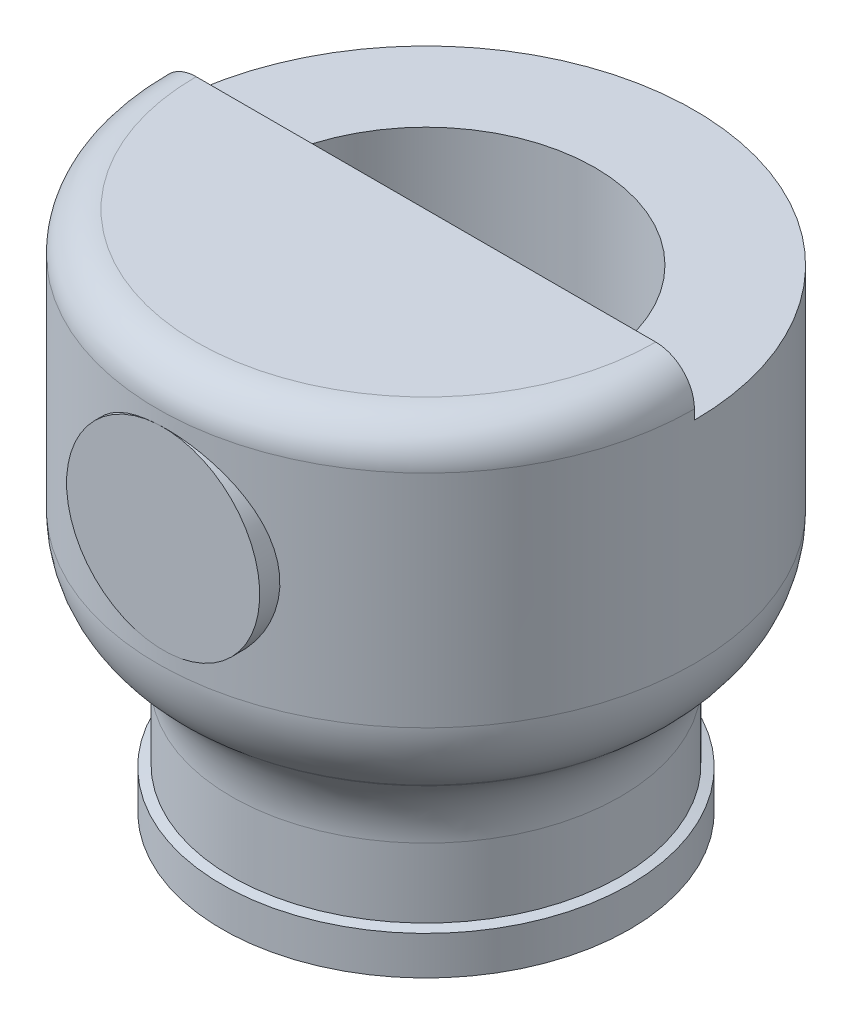
ISO-10303-21;
HEADER;
FILE_DESCRIPTION(('STEP AP214'),'2;1');
FILE_NAME('part.step','',(''),(''),'','','');
FILE_SCHEMA(('AUTOMOTIVE_DESIGN { 1 0 10303 214 1 1 1 1 }'));
ENDSEC;
DATA;
#1=APPLICATION_CONTEXT('core data for automotive mechanical design processes');
#2=APPLICATION_PROTOCOL_DEFINITION('international standard','automotive_design',2000,#1);
#3=PRODUCT_CONTEXT('',#1,'mechanical');
#4=PRODUCT('Part','Part','',(#3));
#5=PRODUCT_RELATED_PRODUCT_CATEGORY('part','',(#4));
#6=PRODUCT_DEFINITION_FORMATION('','',#4);
#7=PRODUCT_DEFINITION_CONTEXT('part definition',#1,'design');
#8=PRODUCT_DEFINITION('design','',#6,#7);
#9=PRODUCT_DEFINITION_SHAPE('','',#8);
#10=(LENGTH_UNIT() NAMED_UNIT(*) SI_UNIT(.MILLI.,.METRE.));
#11=(NAMED_UNIT(*) PLANE_ANGLE_UNIT() SI_UNIT($,.RADIAN.));
#12=(NAMED_UNIT(*) SI_UNIT($,.STERADIAN.) SOLID_ANGLE_UNIT());
#13=UNCERTAINTY_MEASURE_WITH_UNIT(LENGTH_MEASURE(1.E-05),#10,'distance_accuracy_value','');
#14=(GEOMETRIC_REPRESENTATION_CONTEXT(3) GLOBAL_UNCERTAINTY_ASSIGNED_CONTEXT((#13)) GLOBAL_UNIT_ASSIGNED_CONTEXT((#10,
#11,#12)) REPRESENTATION_CONTEXT('',''));
#15=CARTESIAN_POINT('',(0.,0.,0.));
#16=DIRECTION('',(0.,0.,1.));
#17=DIRECTION('',(1.,0.,0.));
#18=AXIS2_PLACEMENT_3D('',#15,#16,#17);
#19=CARTESIAN_POINT('',(2.76491495539482,62.,0.));
#20=DIRECTION('',(0.,-1.,0.));
#21=DIRECTION('',(1.,0.,0.));
#22=AXIS2_PLACEMENT_3D('',#19,#20,#21);
#23=CYLINDRICAL_SURFACE('',#22,17.5);
#24=DIRECTION('',(0.,-1.,0.));
#25=VECTOR('',#24,1.);
#26=CARTESIAN_POINT('',(20.2649149553948,62.,0.));
#27=LINE('',#26,#25);
#28=CARTESIAN_POINT('',(20.2649149553948,49.,0.));
#29=VERTEX_POINT('',#28);
#30=CARTESIAN_POINT('',(20.2649149553948,14.9310408558861,0.));
#31=VERTEX_POINT('',#30);
#32=EDGE_CURVE('E353',#29,#31,#27,.T.);
#33=ORIENTED_EDGE('',*,*,#32,.F.);
#34=CARTESIAN_POINT('',(2.76491495539483,49.,0.));
#35=DIRECTION('',(0.,1.,0.));
#36=DIRECTION('',(0.,0.,1.));
#37=AXIS2_PLACEMENT_3D('',#34,#35,#36);
#38=CIRCLE('',#37,17.5);
#39=CARTESIAN_POINT('',(-14.7350850446052,49.,0.));
#40=VERTEX_POINT('',#39);
#41=EDGE_CURVE('E361',#29,#40,#38,.T.);
#42=ORIENTED_EDGE('',*,*,#41,.T.);
#43=DIRECTION('',(0.,-1.,0.));
#44=VECTOR('',#43,1.);
#45=CARTESIAN_POINT('',(-14.7350850446052,62.,0.));
#46=LINE('',#45,#44);
#47=CARTESIAN_POINT('',(-14.7350850446052,14.9310408558861,0.));
#48=VERTEX_POINT('',#47);
#49=EDGE_CURVE('E351',#40,#48,#46,.T.);
#50=ORIENTED_EDGE('',*,*,#49,.T.);
#51=CARTESIAN_POINT('',(2.76491495539483,14.9310408558861,0.));
#52=DIRECTION('',(0.,-1.,0.));
#53=DIRECTION('',(1.,0.,0.));
#54=AXIS2_PLACEMENT_3D('',#51,#52,#53);
#55=CIRCLE('',#54,17.5);
#56=EDGE_CURVE('E44',#31,#48,#55,.F.);
#57=ORIENTED_EDGE('',*,*,#56,.F.);
#58=EDGE_LOOP('',(#33,#42,#50,#57));
#59=FACE_BOUND('',#58,.T.);
#60=ADVANCED_FACE('F36',(#59),#23,.F.);
#61=CARTESIAN_POINT('',(26.5604444311898,54.,0.));
#62=DIRECTION('',(0.,1.,0.));
#63=DIRECTION('',(-1.,0.,0.));
#64=AXIS2_PLACEMENT_3D('',#61,#62,#63);
#65=PLANE('',#64);
#66=DIRECTION('',(-1.,0.,0.));
#67=VECTOR('',#66,1.);
#68=CARTESIAN_POINT('',(26.5604444311898,54.,0.));
#69=LINE('',#68,#67);
#70=CARTESIAN_POINT('',(26.5604444311898,54.,0.));
#71=VERTEX_POINT('',#70);
#72=CARTESIAN_POINT('',(-21.0306145204002,54.,0.));
#73=VERTEX_POINT('',#72);
#74=EDGE_CURVE('E95',#71,#73,#69,.T.);
#75=ORIENTED_EDGE('',*,*,#74,.T.);
#76=CARTESIAN_POINT('',(2.76491495539482,54.,0.));
#77=DIRECTION('',(0.,-1.,0.));
#78=DIRECTION('',(1.,0.,0.));
#79=AXIS2_PLACEMENT_3D('',#76,#77,#78);
#80=CIRCLE('',#79,23.795529475795);
#81=EDGE_CURVE('E99',#71,#73,#80,.T.);
#82=ORIENTED_EDGE('',*,*,#81,.F.);
#83=EDGE_LOOP('',(#75,#82));
#84=FACE_BOUND('',#83,.T.);
#85=ADVANCED_FACE('F97',(#84),#65,.T.);
#86=CARTESIAN_POINT('',(19.9,15.,0.));
#87=DIRECTION('',(0.,-1.,0.));
#88=DIRECTION('',(1.,0.,0.));
#89=AXIS2_PLACEMENT_3D('',#86,#87,#88);
#90=PLANE('',#89);
#91=CARTESIAN_POINT('',(2.76491495539483,15.,0.));
#92=DIRECTION('',(0.,-1.,0.));
#93=DIRECTION('',(1.,0.,0.));
#94=AXIS2_PLACEMENT_3D('',#91,#92,#93);
#95=CIRCLE('',#94,17.1350850446052);
#96=CARTESIAN_POINT('',(19.9,15.,0.));
#97=VERTEX_POINT('',#96);
#98=CARTESIAN_POINT('',(-14.3701700892103,15.,0.));
#99=VERTEX_POINT('',#98);
#100=EDGE_CURVE('E116',#97,#99,#95,.T.);
#101=ORIENTED_EDGE('',*,*,#100,.T.);
#102=DIRECTION('',(1.,0.,0.));
#103=VECTOR('',#102,1.);
#104=CARTESIAN_POINT('',(19.9,15.,0.));
#105=LINE('',#104,#103);
#106=EDGE_CURVE('E59',#99,#97,#105,.T.);
#107=ORIENTED_EDGE('',*,*,#106,.T.);
#108=EDGE_LOOP('',(#101,#107));
#109=FACE_BOUND('',#108,.T.);
#110=ADVANCED_FACE('F174',(#109),#90,.T.);
#111=CARTESIAN_POINT('',(2.76491495539483,14.,0.));
#112=DIRECTION('',(0.,-1.,0.));
#113=DIRECTION('',(1.,0.,0.));
#114=AXIS2_PLACEMENT_3D('',#111,#112,#113);
#115=TOROIDAL_SURFACE('',#114,17.1350850446052,1.);
#116=CARTESIAN_POINT('',(2.76491495539483,14.,0.));
#117=DIRECTION('',(0.,-1.,0.));
#118=DIRECTION('',(1.,0.,0.));
#119=AXIS2_PLACEMENT_3D('',#116,#117,#118);
#120=CIRCLE('',#119,18.1350850446052);
#121=CARTESIAN_POINT('',(20.9,14.,0.));
#122=VERTEX_POINT('',#121);
#123=EDGE_CURVE('E121',#122,#122,#120,.T.);
#124=ORIENTED_EDGE('',*,*,#123,.T.);
#125=EDGE_LOOP('',(#124));
#126=FACE_BOUND('',#125,.T.);
#127=ORIENTED_EDGE('',*,*,#100,.F.);
#128=CARTESIAN_POINT('',(19.9,14.,0.));
#129=DIRECTION('',(0.,0.,-1.));
#130=DIRECTION('',(-1.,0.,0.));
#131=AXIS2_PLACEMENT_3D('',#128,#129,#130);
#132=CIRCLE('',#131,1.);
#133=EDGE_CURVE('E11',#97,#31,#132,.T.);
#134=ORIENTED_EDGE('',*,*,#133,.T.);
#135=ORIENTED_EDGE('',*,*,#56,.T.);
#136=CARTESIAN_POINT('',(-14.3701700892103,14.,0.));
#137=DIRECTION('',(0.,0.,-1.));
#138=DIRECTION('',(-1.,0.,0.));
#139=AXIS2_PLACEMENT_3D('',#136,#137,#138);
#140=CIRCLE('',#139,1.);
#141=EDGE_CURVE('E157',#48,#99,#140,.T.);
#142=ORIENTED_EDGE('',*,*,#141,.T.);
#143=EDGE_LOOP('',(#127,#134,#135,#142));
#144=FACE_BOUND('',#143,.T.);
#145=ADVANCED_FACE('F171',(#126,#144),#115,.F.);
#146=CARTESIAN_POINT('',(2.76491495539483,7.82182165652493,0.));
#147=DIRECTION('',(0.,-1.,0.));
#148=DIRECTION('',(1.,0.,0.));
#149=AXIS2_PLACEMENT_3D('',#146,#147,#148);
#150=CYLINDRICAL_SURFACE('',#149,18.1350850446052);
#151=CARTESIAN_POINT('',(2.76491495539483,0.,0.));
#152=DIRECTION('',(0.,-1.,0.));
#153=DIRECTION('',(1.,0.,0.));
#154=AXIS2_PLACEMENT_3D('',#151,#152,#153);
#155=CIRCLE('',#154,18.1350850446052);
#156=CARTESIAN_POINT('',(20.9,0.,0.));
#157=VERTEX_POINT('',#156);
#158=EDGE_CURVE('E145',#157,#157,#155,.T.);
#159=ORIENTED_EDGE('',*,*,#158,.T.);
#160=EDGE_LOOP('',(#159));
#161=FACE_BOUND('',#160,.T.);
#162=ORIENTED_EDGE('',*,*,#123,.F.);
#163=EDGE_LOOP('',(#162));
#164=FACE_BOUND('',#163,.T.);
#165=ADVANCED_FACE('F38',(#161,#164),#150,.F.);
#166=CARTESIAN_POINT('',(20.9,0.,0.));
#167=DIRECTION('',(0.,-1.,0.));
#168=DIRECTION('',(1.,0.,0.));
#169=AXIS2_PLACEMENT_3D('',#166,#167,#168);
#170=PLANE('',#169);
#171=CARTESIAN_POINT('',(2.76491495539483,0.,0.));
#172=DIRECTION('',(0.,-1.,0.));
#173=DIRECTION('',(1.,0.,0.));
#174=AXIS2_PLACEMENT_3D('',#171,#172,#173);
#175=CIRCLE('',#174,21.1066768821093);
#176=CARTESIAN_POINT('',(23.8715918375041,0.,0.));
#177=VERTEX_POINT('',#176);
#178=EDGE_CURVE('E142',#177,#177,#175,.T.);
#179=ORIENTED_EDGE('',*,*,#178,.T.);
#180=EDGE_LOOP('',(#179));
#181=FACE_BOUND('',#180,.T.);
#182=ORIENTED_EDGE('',*,*,#158,.F.);
#183=EDGE_LOOP('',(#182));
#184=FACE_BOUND('',#183,.T.);
#185=ADVANCED_FACE('F308',(#181,#184),#170,.T.);
#186=CARTESIAN_POINT('',(2.76491495539483,7.82182165652493,0.));
#187=DIRECTION('',(0.,-1.,0.));
#188=DIRECTION('',(1.,0.,0.));
#189=AXIS2_PLACEMENT_3D('',#186,#187,#188);
#190=CYLINDRICAL_SURFACE('',#189,21.1066768821093);
#191=CARTESIAN_POINT('',(2.76491495539483,4.,0.));
#192=DIRECTION('',(0.,-1.,0.));
#193=DIRECTION('',(1.,0.,0.));
#194=AXIS2_PLACEMENT_3D('',#191,#192,#193);
#195=CIRCLE('',#194,21.1066768821093);
#196=CARTESIAN_POINT('',(23.8715918375041,4.,0.));
#197=VERTEX_POINT('',#196);
#198=EDGE_CURVE('E139',#197,#197,#195,.T.);
#199=ORIENTED_EDGE('',*,*,#198,.T.);
#200=EDGE_LOOP('',(#199));
#201=FACE_BOUND('',#200,.T.);
#202=ORIENTED_EDGE('',*,*,#178,.F.);
#203=EDGE_LOOP('',(#202));
#204=FACE_BOUND('',#203,.T.);
#205=ADVANCED_FACE('F300',(#201,#204),#190,.T.);
#206=CARTESIAN_POINT('',(2.76491495539483,4.,0.));
#207=DIRECTION('',(0.,-1.,0.));
#208=DIRECTION('',(1.,0.,0.));
#209=AXIS2_PLACEMENT_3D('',#206,#207,#208);
#210=CONICAL_SURFACE('',#209,21.1066768821093,1.33186665186768);
#211=CARTESIAN_POINT('',(2.76491495539483,4.23666284308145,0.));
#212=DIRECTION('',(0.,-1.,0.));
#213=DIRECTION('',(1.,0.,0.));
#214=AXIS2_PLACEMENT_3D('',#211,#212,#213);
#215=CIRCLE('',#214,20.1350850446052);
#216=CARTESIAN_POINT('',(22.9,4.23666284308145,0.));
#217=VERTEX_POINT('',#216);
#218=EDGE_CURVE('E136',#217,#217,#215,.T.);
#219=ORIENTED_EDGE('',*,*,#218,.T.);
#220=EDGE_LOOP('',(#219));
#221=FACE_BOUND('',#220,.T.);
#222=ORIENTED_EDGE('',*,*,#198,.F.);
#223=EDGE_LOOP('',(#222));
#224=FACE_BOUND('',#223,.T.);
#225=ADVANCED_FACE('F292',(#221,#224),#210,.T.);
#226=CARTESIAN_POINT('',(2.76491495539483,7.82182165652493,0.));
#227=DIRECTION('',(0.,-1.,0.));
#228=DIRECTION('',(1.,0.,0.));
#229=AXIS2_PLACEMENT_3D('',#226,#227,#228);
#230=CYLINDRICAL_SURFACE('',#229,20.1350850446052);
#231=CARTESIAN_POINT('',(2.76491495539483,11.4043081021399,0.));
#232=DIRECTION('',(0.,-1.,0.));
#233=DIRECTION('',(1.,0.,0.));
#234=AXIS2_PLACEMENT_3D('',#231,#232,#233);
#235=CIRCLE('',#234,20.1350850446052);
#236=CARTESIAN_POINT('',(22.9,11.4043081021399,0.));
#237=VERTEX_POINT('',#236);
#238=EDGE_CURVE('E133',#237,#237,#235,.T.);
#239=ORIENTED_EDGE('',*,*,#238,.T.);
#240=EDGE_LOOP('',(#239));
#241=FACE_BOUND('',#240,.T.);
#242=ORIENTED_EDGE('',*,*,#218,.F.);
#243=EDGE_LOOP('',(#242));
#244=FACE_BOUND('',#243,.T.);
#245=ADVANCED_FACE('F284',(#241,#244),#230,.T.);
#246=CARTESIAN_POINT('',(2.76491495539483,11.40430810214,0.));
#247=DIRECTION('',(0.,-1.,0.));
#248=DIRECTION('',(1.,0.,0.));
#249=AXIS2_PLACEMENT_3D('',#246,#247,#248);
#250=TOROIDAL_SURFACE('',#249,30.1350850446052,10.);
#251=CARTESIAN_POINT('',(2.76491495539483,19.0647525333298,0.));
#252=DIRECTION('',(0.,-1.,0.));
#253=DIRECTION('',(1.,0.,0.));
#254=AXIS2_PLACEMENT_3D('',#251,#252,#253);
#255=CIRCLE('',#254,23.7072089477399);
#256=CARTESIAN_POINT('',(26.4721239031347,19.0647525333298,0.));
#257=VERTEX_POINT('',#256);
#258=EDGE_CURVE('E130',#257,#257,#255,.T.);
#259=ORIENTED_EDGE('',*,*,#258,.T.);
#260=EDGE_LOOP('',(#259));
#261=FACE_BOUND('',#260,.T.);
#262=ORIENTED_EDGE('',*,*,#238,.F.);
#263=EDGE_LOOP('',(#262));
#264=FACE_BOUND('',#263,.T.);
#265=ADVANCED_FACE('F276',(#261,#264),#250,.F.);
#266=CARTESIAN_POINT('',(2.76491495539483,19.0647525333298,0.));
#267=DIRECTION('',(0.,1.,0.));
#268=DIRECTION('',(-1.,0.,0.));
#269=AXIS2_PLACEMENT_3D('',#266,#267,#268);
#270=CONICAL_SURFACE('',#269,23.7072089477399,0.872664625997171);
#271=CARTESIAN_POINT('',(2.76491495539483,19.4978929309155,0.));
#272=DIRECTION('',(0.,-1.,0.));
#273=DIRECTION('',(1.,0.,0.));
#274=AXIS2_PLACEMENT_3D('',#271,#272,#273);
#275=CIRCLE('',#274,24.2234055726603);
#276=CARTESIAN_POINT('',(26.9883205280551,19.4978929309155,0.));
#277=VERTEX_POINT('',#276);
#278=EDGE_CURVE('E127',#277,#277,#275,.T.);
#279=ORIENTED_EDGE('',*,*,#278,.T.);
#280=EDGE_LOOP('',(#279));
#281=FACE_BOUND('',#280,.T.);
#282=ORIENTED_EDGE('',*,*,#258,.F.);
#283=EDGE_LOOP('',(#282));
#284=FACE_BOUND('',#283,.T.);
#285=ADVANCED_FACE('F272',(#281,#284),#270,.T.);
#286=CARTESIAN_POINT('',(2.76491495539483,27.1583373621054,0.));
#287=DIRECTION('',(0.,-1.,0.));
#288=DIRECTION('',(1.,0.,0.));
#289=AXIS2_PLACEMENT_3D('',#286,#287,#288);
#290=TOROIDAL_SURFACE('',#289,17.795529475795,10.);
#291=CARTESIAN_POINT('',(2.76491495539483,27.1583373621054,0.));
#292=DIRECTION('',(0.,-1.,0.));
#293=DIRECTION('',(1.,0.,0.));
#294=AXIS2_PLACEMENT_3D('',#291,#292,#293);
#295=CIRCLE('',#294,27.795529475795);
#296=CARTESIAN_POINT('',(30.5604444311898,27.1583373621054,0.));
#297=VERTEX_POINT('',#296);
#298=EDGE_CURVE('E118',#297,#297,#295,.T.);
#299=ORIENTED_EDGE('',*,*,#298,.T.);
#300=EDGE_LOOP('',(#299));
#301=FACE_BOUND('',#300,.T.);
#302=ORIENTED_EDGE('',*,*,#278,.F.);
#303=EDGE_LOOP('',(#302));
#304=FACE_BOUND('',#303,.T.);
#305=ADVANCED_FACE('F186',(#301,#304),#290,.T.);
#306=CARTESIAN_POINT('',(2.76491495539483,7.82182165652493,0.));
#307=DIRECTION('',(0.,-1.,0.));
#308=DIRECTION('',(1.,0.,0.));
#309=AXIS2_PLACEMENT_3D('',#306,#307,#308);
#310=CYLINDRICAL_SURFACE('',#309,27.795529475795);
#311=DIRECTION('',(0.,-1.,0.));
#312=VECTOR('',#311,1.);
#313=CARTESIAN_POINT('',(-25.0306145204002,7.82182165652492,0.));
#314=LINE('',#313,#312);
#315=CARTESIAN_POINT('',(-25.0306145204002,49.,0.));
#316=VERTEX_POINT('',#315);
#317=CARTESIAN_POINT('',(-25.0306145204002,50.,0.));
#318=VERTEX_POINT('',#317);
#319=EDGE_CURVE('E107',#316,#318,#314,.F.);
#320=ORIENTED_EDGE('',*,*,#319,.F.);
#321=CARTESIAN_POINT('',(2.76491495539483,49.,0.));
#322=DIRECTION('',(0.,1.,0.));
#323=DIRECTION('',(0.,0.,1.));
#324=AXIS2_PLACEMENT_3D('',#321,#322,#323);
#325=CIRCLE('',#324,27.795529475795);
#326=CARTESIAN_POINT('',(30.5604444311898,49.,0.));
#327=VERTEX_POINT('',#326);
#328=EDGE_CURVE('E358',#316,#327,#325,.F.);
#329=ORIENTED_EDGE('',*,*,#328,.T.);
#330=DIRECTION('',(0.,-1.,0.));
#331=VECTOR('',#330,1.);
#332=CARTESIAN_POINT('',(30.5604444311898,7.82182165652493,0.));
#333=LINE('',#332,#331);
#334=CARTESIAN_POINT('',(30.5604444311898,50.,0.));
#335=VERTEX_POINT('',#334);
#336=EDGE_CURVE('E111',#335,#327,#333,.T.);
#337=ORIENTED_EDGE('',*,*,#336,.F.);
#338=CARTESIAN_POINT('',(2.76491495539482,50.,0.));
#339=DIRECTION('',(0.,-1.,0.));
#340=DIRECTION('',(1.,0.,0.));
#341=AXIS2_PLACEMENT_3D('',#338,#339,#340);
#342=CIRCLE('',#341,27.795529475795);
#343=EDGE_CURVE('E115',#335,#318,#342,.T.);
#344=ORIENTED_EDGE('',*,*,#343,.T.);
#345=EDGE_LOOP('',(#320,#329,#337,#344));
#346=FACE_BOUND('',#345,.T.);
#347=CARTESIAN_POINT('',(13.3463458867871,38.6583373621054,25.7026220118486));
#348=CARTESIAN_POINT('',(13.3463467506797,38.9277821022739,25.7026212426184));
#349=CARTESIAN_POINT('',(13.3354465811937,39.1972148635378,25.7071171137235));
#350=CARTESIAN_POINT('',(13.2919687629021,39.7340174371551,25.7249519118154));
#351=CARTESIAN_POINT('',(13.2593923457373,40.0013873658451,25.7382903363697));
#352=CARTESIAN_POINT('',(13.1729081194495,40.5320945802206,25.7733836810905));
#353=CARTESIAN_POINT('',(13.1189995294657,40.79543171792,25.7951389093522));
#354=CARTESIAN_POINT('',(12.9903943982892,41.3162067659098,25.8463887620421));
#355=CARTESIAN_POINT('',(12.9156973821031,41.5736445412607,25.8758835633105));
#356=CARTESIAN_POINT('',(12.7464464105734,42.0802133582729,25.9416402412638));
#357=CARTESIAN_POINT('',(12.651947157288,42.329365136829,25.9778834459237));
#358=CARTESIAN_POINT('',(12.44373220242,42.8186599126973,26.0561762717797));
#359=CARTESIAN_POINT('',(12.330009340582,43.0587995123479,26.0982280554375));
#360=CARTESIAN_POINT('',(12.0842401425005,43.528602925991,26.1869948362899));
#361=CARTESIAN_POINT('',(11.9521936997097,43.7582666790585,26.2337098605997));
#362=CARTESIAN_POINT('',(11.6706780123648,44.2058963523142,26.3306095370754));
#363=CARTESIAN_POINT('',(11.5212074978844,44.4238614181689,26.3807944420297));
#364=CARTESIAN_POINT('',(11.1985025620434,44.8567103541455,26.4857726252769));
#365=CARTESIAN_POINT('',(11.0244902858668,45.0709889713522,26.5406716961283));
#366=CARTESIAN_POINT('',(10.6595087786535,45.4842923905928,26.6515143306982));
#367=CARTESIAN_POINT('',(10.4685391398865,45.683316825634,26.7074579195059));
#368=CARTESIAN_POINT('',(10.0707167754452,46.0650127403382,26.8190118536809));
#369=CARTESIAN_POINT('',(9.86386023069171,46.2476802649348,26.8746221154337));
#370=CARTESIAN_POINT('',(9.43549130510837,46.5954921209992,26.9841386350754));
#371=CARTESIAN_POINT('',(9.21397928881647,46.7606368880596,27.038044935299));
#372=CARTESIAN_POINT('',(8.74863878036111,47.0784128766494,27.1449016086897));
#373=CARTESIAN_POINT('',(8.50427674096215,47.2303042566693,27.1977325815785));
#374=CARTESIAN_POINT('',(8.00273380579803,47.5127627227737,27.2987566692341));
#375=CARTESIAN_POINT('',(7.74555800532649,47.6433381980195,27.3469516054933));
#376=CARTESIAN_POINT('',(7.2200167476639,47.8821093354802,27.4374672990011));
#377=CARTESIAN_POINT('',(6.95165142646173,47.9903052695837,27.4797881276121));
#378=CARTESIAN_POINT('',(6.40564839316566,48.1832779921821,27.5574406379041));
#379=CARTESIAN_POINT('',(6.12801115886875,48.2680559853613,27.5927726790812));
#380=CARTESIAN_POINT('',(5.57638215157694,48.4105135832943,27.6543152072922));
#381=CARTESIAN_POINT('',(5.30266011964647,48.4691091447917,27.6808239838258));
#382=CARTESIAN_POINT('',(4.75062513289938,48.5632043331973,27.7258920994341));
#383=CARTESIAN_POINT('',(4.4723122799301,48.5987044717727,27.7444516146174));
#384=CARTESIAN_POINT('',(3.91333763495258,48.6461887564039,27.7732043831257));
#385=CARTESIAN_POINT('',(3.6326765478635,48.6581797221137,27.7834000621734));
#386=CARTESIAN_POINT('',(3.07116470286908,48.6584918943381,27.7952607055486));
#387=CARTESIAN_POINT('',(2.79031395171638,48.6468139032719,27.7969259590657));
#388=CARTESIAN_POINT('',(2.24491810603403,48.6010682628443,27.7919345123894));
#389=CARTESIAN_POINT('',(1.9802701976664,48.5681695673053,27.7856967619089));
#390=CARTESIAN_POINT('',(1.45472369944559,48.4814067313321,27.7658783501912));
#391=CARTESIAN_POINT('',(1.19382496243998,48.4275434160882,27.7522979779594));
#392=CARTESIAN_POINT('',(0.677577935562517,48.2993135221171,27.7182504886453));
#393=CARTESIAN_POINT('',(0.422229730170447,48.2249466315582,27.6977832668222));
#394=CARTESIAN_POINT('',(-0.0812182002820311,48.0563308589155,27.6505861686878));
#395=CARTESIAN_POINT('',(-0.329317769825685,47.9620815506179,27.6238561581216));
#396=CARTESIAN_POINT('',(-0.818471743992125,47.753692525213,27.5646864705793));
#397=CARTESIAN_POINT('',(-1.05946155178538,47.6394127245774,27.5322065644623));
#398=CARTESIAN_POINT('',(-1.53110602263131,47.3922583555493,27.4625657330638));
#399=CARTESIAN_POINT('',(-1.76175692596454,47.2593770940488,27.4254031233522));
#400=CARTESIAN_POINT('',(-2.21130548967729,46.9759762894753,27.3474083145757));
#401=CARTESIAN_POINT('',(-2.43020277787631,46.8254561883447,27.3065759994182));
#402=CARTESIAN_POINT('',(-2.85503064445834,46.5077508697439,27.2223176301386));
#403=CARTESIAN_POINT('',(-3.06096039890063,46.340564595066,27.1788914115441));
#404=CARTESIAN_POINT('',(-3.46888943397179,45.9815950003482,27.0883184701548));
#405=CARTESIAN_POINT('',(-3.670150520127,45.7889914436546,27.0410950137027));
#406=CARTESIAN_POINT('',(-4.05588736727981,45.3877061868811,26.9463832037301));
#407=CARTESIAN_POINT('',(-4.24036262263078,45.1790240028073,26.8988948422756));
#408=CARTESIAN_POINT('',(-4.5914220414673,44.7467994372934,26.8050143466062));
#409=CARTESIAN_POINT('',(-4.75800206361397,44.5232536353894,26.7586224680701));
#410=CARTESIAN_POINT('',(-5.07212087537345,44.0626976394474,26.6683153425431));
#411=CARTESIAN_POINT('',(-5.2196603768811,43.8256879492801,26.6244000029929));
#412=CARTESIAN_POINT('',(-5.49772859126478,43.3342142456592,26.5394385045658));
#413=CARTESIAN_POINT('',(-5.62780461077978,43.0794788683478,26.4984781635685));
#414=CARTESIAN_POINT('',(-5.86586399421236,42.559232637673,26.4218991371288));
#415=CARTESIAN_POINT('',(-5.97385638830328,42.2937262421033,26.3862782699295));
#416=CARTESIAN_POINT('',(-6.1668392723074,41.7537372736574,26.3215803603233));
#417=CARTESIAN_POINT('',(-6.2518328039325,41.4792558931539,26.2925024526638));
#418=CARTESIAN_POINT('',(-6.39800337069516,40.9233418126132,26.2419203231456));
#419=CARTESIAN_POINT('',(-6.45918167304372,40.6419094832844,26.2204156983175));
#420=CARTESIAN_POINT('',(-6.55494105559617,40.0867471613471,26.1865271745711));
#421=CARTESIAN_POINT('',(-6.59056927192223,39.8132193541774,26.1737851983376));
#422=CARTESIAN_POINT('',(-6.63910912568212,39.2639004168782,26.1563847172211));
#423=CARTESIAN_POINT('',(-6.6520214135389,38.9881093517795,26.1517259808916));
#424=CARTESIAN_POINT('',(-6.65499588625463,38.436440217703,26.1506546773984));
#425=CARTESIAN_POINT('',(-6.64506227006915,38.1605621740297,26.1542405949113));
#426=CARTESIAN_POINT('',(-6.60245672026117,37.6107987661365,26.1695303281976));
#427=CARTESIAN_POINT('',(-6.56978514634915,37.3369133704626,26.1812340155494));
#428=CARTESIAN_POINT('',(-6.48373595936502,36.8037277442479,26.2117512471871));
#429=CARTESIAN_POINT('',(-6.43120768216105,36.5442730018554,26.2302724288113));
#430=CARTESIAN_POINT('',(-6.30589572281171,36.0307712719075,26.2738700992557));
#431=CARTESIAN_POINT('',(-6.23310488253185,35.7767262296359,26.2989489044905));
#432=CARTESIAN_POINT('',(-6.06790705793705,35.2758269101046,26.3548915465073));
#433=CARTESIAN_POINT('',(-5.97550466195667,35.0289709662142,26.3857540299383));
#434=CARTESIAN_POINT('',(-5.77175338960273,34.5437867607262,26.4523767744537));
#435=CARTESIAN_POINT('',(-5.66039717760229,34.3054618442483,26.4881389307914));
#436=CARTESIAN_POINT('',(-5.41581964512394,33.831564001845,26.564712662015));
#437=CARTESIAN_POINT('',(-5.28202751992324,33.5963054174963,26.605646401383));
#438=CARTESIAN_POINT('',(-4.99603821175475,33.1376763735824,26.6904723195448));
#439=CARTESIAN_POINT('',(-4.84383279563464,32.9143112967348,26.734365817827));
#440=CARTESIAN_POINT('',(-4.52202772496277,32.4808325603602,26.8238664339569));
#441=CARTESIAN_POINT('',(-4.35242713478869,32.270719614599,26.8694736438951));
#442=CARTESIAN_POINT('',(-3.99685318796656,31.864943181332,26.9611508600873));
#443=CARTESIAN_POINT('',(-3.81087945517322,31.6692800259756,27.007220876952));
#444=CARTESIAN_POINT('',(-3.41386155361355,31.2840646941256,27.1008825380269));
#445=CARTESIAN_POINT('',(-3.20202640665692,31.0953168380638,27.1484339302512));
#446=CARTESIAN_POINT('',(-2.76286436248656,30.7363456425542,27.2412455306916));
#447=CARTESIAN_POINT('',(-2.53554312242131,30.5661155968439,27.2865065651682));
#448=CARTESIAN_POINT('',(-2.06667271203996,30.2452550666619,27.3734191976298));
#449=CARTESIAN_POINT('',(-1.82511812373015,30.0946321166597,27.4150694060318));
#450=CARTESIAN_POINT('',(-1.32953585786986,29.8142919890175,27.4934506514793));
#451=CARTESIAN_POINT('',(-1.07551358642064,29.6845658530069,27.5301837953007));
#452=CARTESIAN_POINT('',(-0.558963445896263,29.4480975901194,27.5972916324096));
#453=CARTESIAN_POINT('',(-0.296532196118554,29.3411599161002,27.6277203553277));
#454=CARTESIAN_POINT('',(0.237105421191776,29.1497639570286,27.681646347434));
#455=CARTESIAN_POINT('',(0.508311784862325,29.0653056620829,27.7051436196728));
#456=CARTESIAN_POINT('',(1.05736622775294,28.9196922101092,27.7443950186722));
#457=CARTESIAN_POINT('',(1.33521203382265,28.8585291955788,27.760151756837));
#458=CARTESIAN_POINT('',(1.89543988383297,28.7600674488549,27.7833412546476));
#459=CARTESIAN_POINT('',(2.17782171303057,28.7227675903324,27.7907744071749));
#460=CARTESIAN_POINT('',(2.73014021528458,28.6736923897316,27.7968081006747));
#461=CARTESIAN_POINT('',(2.99996433279007,28.6606955856305,27.7958459939314));
#462=CARTESIAN_POINT('',(3.53963003763627,28.6565651175248,27.7860414433971));
#463=CARTESIAN_POINT('',(3.8094716239489,28.6654306374236,27.7771992937672));
#464=CARTESIAN_POINT('',(4.34716757247668,28.7048945975942,27.7517634945061));
#465=CARTESIAN_POINT('',(4.61502208219522,28.7354914080766,27.7351704262052));
#466=CARTESIAN_POINT('',(5.14683840460148,28.8180812466258,27.6945666520365));
#467=CARTESIAN_POINT('',(5.41080019683061,28.870074387102,27.6705559071988));
#468=CARTESIAN_POINT('',(5.92904610024611,28.9939919992937,27.6160569422403));
#469=CARTESIAN_POINT('',(6.18341619783529,29.0656031552389,27.5856721734139));
#470=CARTESIAN_POINT('',(6.68506895537541,29.2284645935136,27.5188646144497));
#471=CARTESIAN_POINT('',(6.93234905101865,29.3197218823934,27.4824396712259));
#472=CARTESIAN_POINT('',(7.41818360014348,29.5210909377065,27.4043623721521));
#473=CARTESIAN_POINT('',(7.65673988387677,29.6311987214527,27.3627111209994));
#474=CARTESIAN_POINT('',(8.12391548923101,29.869502337868,27.2750634742108));
#475=CARTESIAN_POINT('',(8.35253092803971,29.9977051567529,27.2290654026116));
#476=CARTESIAN_POINT('',(8.80852283960875,30.2774457183902,27.1315873881407));
#477=CARTESIAN_POINT('',(9.03538233947552,30.4297729865935,27.079954013771));
#478=CARTESIAN_POINT('',(9.47561863541725,30.7522319968814,26.9742320700564));
#479=CARTESIAN_POINT('',(9.68898924827505,30.9223718105583,26.9201423940019));
#480=CARTESIAN_POINT('',(10.1009819192527,31.2793675026282,26.8108003364131));
#481=CARTESIAN_POINT('',(10.2996021560979,31.4662254390003,26.7555478123759));
#482=CARTESIAN_POINT('',(10.6809508336662,31.8555565786895,26.6452105314894));
#483=CARTESIAN_POINT('',(10.8636790200245,32.0580300318472,26.5901257773391));
#484=CARTESIAN_POINT('',(11.2206302863772,32.4876508411687,26.4788399761401));
#485=CARTESIAN_POINT('',(11.394011161067,32.7155185914245,26.4227143435104));
#486=CARTESIAN_POINT('',(11.7208572308537,33.1857229334844,26.3137271080731));
#487=CARTESIAN_POINT('',(11.8743299975217,33.4280539730205,26.2608642683739));
#488=CARTESIAN_POINT('',(12.1603208389707,33.9258673231902,26.1599086931028));
#489=CARTESIAN_POINT('',(12.2928309519575,34.1813545820673,26.1118177725189));
#490=CARTESIAN_POINT('',(12.5356343745004,34.7036110828207,26.0219381487292));
#491=CARTESIAN_POINT('',(12.6459377702971,34.9703751358822,25.9801465865465));
#492=CARTESIAN_POINT('',(12.8433877754872,35.5135432745424,25.9041898684053));
#493=CARTESIAN_POINT('',(12.9305241387967,35.789951564566,25.8700280879356));
#494=CARTESIAN_POINT('',(13.0806448742074,36.3501956411642,25.8105348341637));
#495=CARTESIAN_POINT('',(13.143629103182,36.6340314717442,25.7852034131907));
#496=CARTESIAN_POINT('',(13.2446847730938,37.2066584983713,25.7442976712579));
#497=CARTESIAN_POINT('',(13.2827686278462,37.4954471514337,25.7287184885891));
#498=CARTESIAN_POINT('',(13.3335977957686,38.0756077855596,25.7078814502822));
#499=CARTESIAN_POINT('',(13.346344952637,38.3669795771037,25.7026228436376));
#500=CARTESIAN_POINT('',(13.3463458867871,38.6583373621054,25.7026220118486));
#501=B_SPLINE_CURVE_WITH_KNOTS('',3,(#347,#348,#349,#350,#351,#352,#353,#354,#355,#356,#357,
#358,#359,#360,#361,#362,#363,#364,#365,#366,#367,#368,#369,#370,#371,#372,#373,#374,#375,#376,
#377,#378,#379,#380,#381,#382,#383,#384,#385,#386,#387,#388,#389,#390,#391,#392,#393,#394,#395,
#396,#397,#398,#399,#400,#401,#402,#403,#404,#405,#406,#407,#408,#409,#410,#411,#412,#413,#414,
#415,#416,#417,#418,#419,#420,#421,#422,#423,#424,#425,#426,#427,#428,#429,#430,#431,#432,#433,
#434,#435,#436,#437,#438,#439,#440,#441,#442,#443,#444,#445,#446,#447,#448,#449,#450,#451,#452,
#453,#454,#455,#456,#457,#458,#459,#460,#461,#462,#463,#464,#465,#466,#467,#468,#469,#470,#471,
#472,#473,#474,#475,#476,#477,#478,#479,#480,#481,#482,#483,#484,#485,#486,#487,#488,#489,#490,
#491,#492,#493,#494,#495,#496,#497,#498,#499,#500),.UNSPECIFIED.,.T.,.F.,(4,2,2,2,2,2,2,2,2,2,2,
2,2,2,2,2,2,2,2,2,2,2,2,2,2,2,2,2,2,2,2,2,2,2,2,2,2,2,2,2,2,2,2,2,2,2,2,2,2,2,2,2,2,2,2,2,2,2,2,
2,2,2,2,2,2,2,2,2,2,2,2,2,2,2,2,2,4),(0.,0.808057267816626,1.61606862586876,2.42410956378593,
3.23216896609579,4.03802492206399,4.84418170086265,5.65034316747197,6.45656342668973,
7.29995003129204,8.14335692014369,8.98696719539949,9.83055649470299,10.7070666362457,
11.5832309794046,12.4593846774343,13.3354932952741,14.1779427925391,15.0203736251361,
15.8625600451619,16.7047179140628,17.5040433523017,18.3033373313968,19.1026434673403,
19.9019667395222,20.7071210172973,21.5125657509117,22.318035974067,23.1235573242502,
23.9702286044995,24.8169253809448,25.6638176808941,26.5106783077056,27.3764233110585,
28.2418135932405,29.1070893673299,29.972319093704,30.7996703059205,31.6269978282852,
32.4541733044068,33.2813356950554,34.0765196457537,34.8719848675378,35.6672641864203,
36.4628520021808,37.2831030231985,38.1037221688819,38.9243854758148,39.7450676410223,
40.6070903069241,41.4687997429028,42.3308393387977,43.1925083929845,44.0464558479673,
44.900402927119,45.7540617141408,46.6076802059269,47.4171058287024,48.2265012369672,
49.0358359491252,49.8451749133136,50.6422741257852,51.4396580861568,52.236873784605,
53.0343981220641,53.8677478695687,54.7014768899097,55.5353086827934,56.3691538193559,
57.2434367976375,58.117386282314,58.9916669076093,59.8655495362763,60.7398180165261,
61.6140916776499,62.4879291459793,63.3617030246541),.UNSPECIFIED.);
#502=CARTESIAN_POINT('',(2.76491495539483,48.6414199557745,27.795529475795));
#503=VERTEX_POINT('',#502);
#504=CARTESIAN_POINT('',(2.76491495539483,28.6752547684362,27.795529475795));
#505=VERTEX_POINT('',#504);
#506=EDGE_CURVE('E156',#503,#505,#501,.T.);
#507=ORIENTED_EDGE('',*,*,#506,.F.);
#508=EDGE_CURVE('E148',#505,#503,#501,.T.);
#509=ORIENTED_EDGE('',*,*,#508,.F.);
#510=EDGE_LOOP('',(#507,#509));
#511=FACE_BOUND('',#510,.T.);
#512=ORIENTED_EDGE('',*,*,#298,.F.);
#513=EDGE_LOOP('',(#512));
#514=FACE_BOUND('',#513,.T.);
#515=ADVANCED_FACE('F158',(#346,#511,#514),#310,.T.);
#516=CARTESIAN_POINT('',(2.76491495539482,50.,0.));
#517=DIRECTION('',(0.,-1.,0.));
#518=DIRECTION('',(1.,0.,0.));
#519=AXIS2_PLACEMENT_3D('',#516,#517,#518);
#520=TOROIDAL_SURFACE('',#519,23.795529475795,4.);
#521=CARTESIAN_POINT('',(-21.0306145204002,50.,0.));
#522=DIRECTION('',(0.,0.,1.));
#523=DIRECTION('',(1.,0.,0.));
#524=AXIS2_PLACEMENT_3D('',#521,#522,#523);
#525=CIRCLE('',#524,4.);
#526=EDGE_CURVE('E104',#318,#73,#525,.F.);
#527=ORIENTED_EDGE('',*,*,#526,.F.);
#528=ORIENTED_EDGE('',*,*,#343,.F.);
#529=CARTESIAN_POINT('',(26.5604444311898,50.,0.));
#530=DIRECTION('',(0.,0.,1.));
#531=DIRECTION('',(1.,0.,0.));
#532=AXIS2_PLACEMENT_3D('',#529,#530,#531);
#533=CIRCLE('',#532,4.);
#534=EDGE_CURVE('E114',#71,#335,#533,.F.);
#535=ORIENTED_EDGE('',*,*,#534,.F.);
#536=ORIENTED_EDGE('',*,*,#81,.T.);
#537=EDGE_LOOP('',(#527,#528,#535,#536));
#538=FACE_BOUND('',#537,.T.);
#539=ADVANCED_FACE('F113',(#538),#520,.T.);
#540=CARTESIAN_POINT('',(3.3463458867871,38.6583373621054,22.795529475795));
#541=DIRECTION('',(0.,0.,1.));
#542=DIRECTION('',(1.,0.,0.));
#543=AXIS2_PLACEMENT_3D('',#540,#541,#542);
#544=CYLINDRICAL_SURFACE('',#543,10.);
#545=CARTESIAN_POINT('',(3.3463458867871,38.6583373621054,27.795529475795));
#546=DIRECTION('',(0.,0.,1.));
#547=DIRECTION('',(1.,0.,0.));
#548=AXIS2_PLACEMENT_3D('',#545,#546,#547);
#549=CIRCLE('',#548,10.);
#550=EDGE_CURVE('E346',#503,#505,#549,.T.);
#551=ORIENTED_EDGE('',*,*,#550,.F.);
#552=ORIENTED_EDGE('',*,*,#506,.T.);
#553=EDGE_LOOP('',(#551,#552));
#554=FACE_BOUND('',#553,.T.);
#555=ADVANCED_FACE('F169',(#554),#544,.T.);
#556=CARTESIAN_POINT('',(3.3463458867871,38.6583373621054,27.795529475795));
#557=DIRECTION('',(0.,0.,1.));
#558=DIRECTION('',(1.,0.,0.));
#559=AXIS2_PLACEMENT_3D('',#556,#557,#558);
#560=PLANE('',#559);
#561=EDGE_CURVE('E101',#505,#503,#549,.T.);
#562=ORIENTED_EDGE('',*,*,#561,.T.);
#563=ORIENTED_EDGE('',*,*,#550,.T.);
#564=EDGE_LOOP('',(#562,#563));
#565=FACE_BOUND('',#564,.T.);
#566=ADVANCED_FACE('F167',(#565),#560,.T.);
#567=ORIENTED_EDGE('',*,*,#561,.F.);
#568=ORIENTED_EDGE('',*,*,#508,.T.);
#569=EDGE_LOOP('',(#567,#568));
#570=FACE_BOUND('',#569,.T.);
#571=ADVANCED_FACE('F162',(#570),#544,.T.);
#572=CARTESIAN_POINT('',(-14.7350850446052,62.,0.));
#573=DIRECTION('',(0.,0.,-1.));
#574=DIRECTION('',(-1.,0.,0.));
#575=AXIS2_PLACEMENT_3D('',#572,#573,#574);
#576=PLANE('',#575);
#577=ORIENTED_EDGE('',*,*,#74,.F.);
#578=ORIENTED_EDGE('',*,*,#534,.T.);
#579=ORIENTED_EDGE('',*,*,#336,.T.);
#580=DIRECTION('',(1.,0.,0.));
#581=VECTOR('',#580,1.);
#582=CARTESIAN_POINT('',(-25.2350850446052,49.,0.));
#583=LINE('',#582,#581);
#584=EDGE_CURVE('E363',#29,#327,#583,.T.);
#585=ORIENTED_EDGE('',*,*,#584,.F.);
#586=ORIENTED_EDGE('',*,*,#32,.T.);
#587=ORIENTED_EDGE('',*,*,#133,.F.);
#588=ORIENTED_EDGE('',*,*,#106,.F.);
#589=ORIENTED_EDGE('',*,*,#141,.F.);
#590=ORIENTED_EDGE('',*,*,#49,.F.);
#591=EDGE_CURVE('E51',#316,#40,#583,.T.);
#592=ORIENTED_EDGE('',*,*,#591,.F.);
#593=ORIENTED_EDGE('',*,*,#319,.T.);
#594=ORIENTED_EDGE('',*,*,#526,.T.);
#595=EDGE_LOOP('',(#577,#578,#579,#585,#586,#587,#588,#589,#590,#592,#593,#594));
#596=FACE_BOUND('',#595,.T.);
#597=ADVANCED_FACE('F105',(#596),#576,.T.);
#598=CARTESIAN_POINT('',(2.76491495539482,49.,0.));
#599=DIRECTION('',(0.,1.,0.));
#600=DIRECTION('',(0.,0.,1.));
#601=AXIS2_PLACEMENT_3D('',#598,#599,#600);
#602=PLANE('',#601);
#603=ORIENTED_EDGE('',*,*,#591,.T.);
#604=ORIENTED_EDGE('',*,*,#41,.F.);
#605=ORIENTED_EDGE('',*,*,#584,.T.);
#606=ORIENTED_EDGE('',*,*,#328,.F.);
#607=EDGE_LOOP('',(#603,#604,#605,#606));
#608=FACE_BOUND('',#607,.T.);
#609=ADVANCED_FACE('F196',(#608),#602,.T.);
#610=CLOSED_SHELL('',(#60,#85,#110,#145,#165,#185,#205,#225,#245,#265,#285,#305,#515,#539,#555,
#566,#571,#597,#609));
#611=MANIFOLD_SOLID_BREP('B2',#610);
#612=ADVANCED_BREP_SHAPE_REPRESENTATION('',(#18,#611),#14);
#613=SHAPE_DEFINITION_REPRESENTATION(#9,#612);
ENDSEC;
END-ISO-10303-21;
